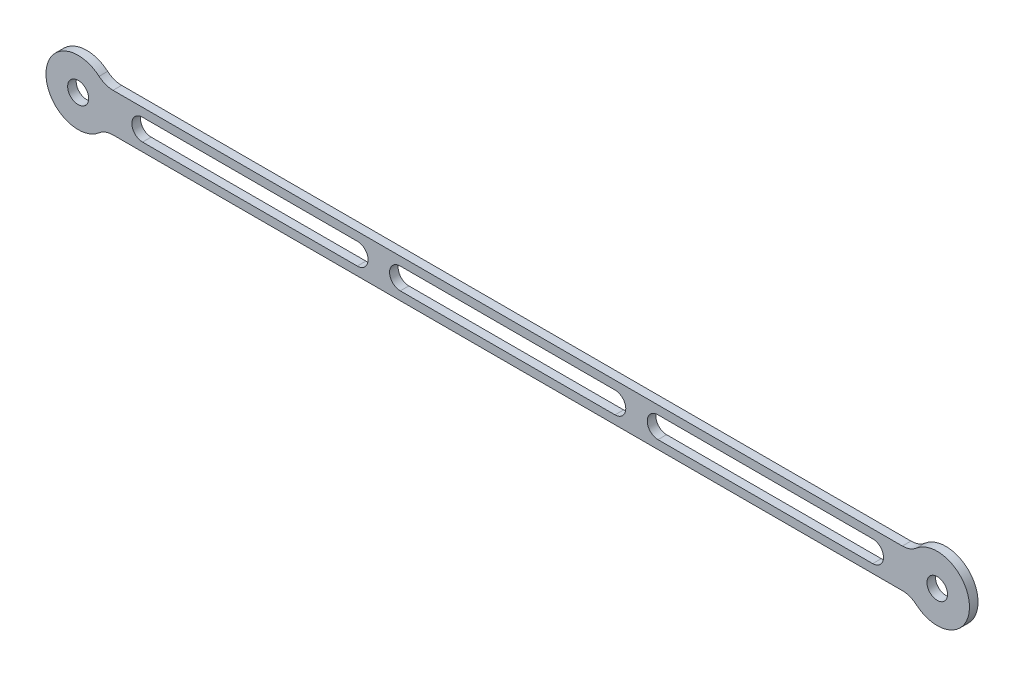
ISO-10303-21;
HEADER;
FILE_DESCRIPTION(('STEP AP214'),'2;1');
FILE_NAME('part.step','',(''),(''),'','','');
FILE_SCHEMA(('AUTOMOTIVE_DESIGN { 1 0 10303 214 1 1 1 1 }'));
ENDSEC;
DATA;
#1=APPLICATION_CONTEXT('core data for automotive mechanical design processes');
#2=APPLICATION_PROTOCOL_DEFINITION('international standard','automotive_design',2000,#1);
#3=PRODUCT_CONTEXT('',#1,'mechanical');
#4=PRODUCT('Part','Part','',(#3));
#5=PRODUCT_RELATED_PRODUCT_CATEGORY('part','',(#4));
#6=PRODUCT_DEFINITION_FORMATION('','',#4);
#7=PRODUCT_DEFINITION_CONTEXT('part definition',#1,'design');
#8=PRODUCT_DEFINITION('design','',#6,#7);
#9=PRODUCT_DEFINITION_SHAPE('','',#8);
#10=(LENGTH_UNIT() NAMED_UNIT(*) SI_UNIT(.MILLI.,.METRE.));
#11=(NAMED_UNIT(*) PLANE_ANGLE_UNIT() SI_UNIT($,.RADIAN.));
#12=(NAMED_UNIT(*) SI_UNIT($,.STERADIAN.) SOLID_ANGLE_UNIT());
#13=UNCERTAINTY_MEASURE_WITH_UNIT(LENGTH_MEASURE(1.E-05),#10,'distance_accuracy_value','');
#14=(GEOMETRIC_REPRESENTATION_CONTEXT(3) GLOBAL_UNCERTAINTY_ASSIGNED_CONTEXT((#13)) GLOBAL_UNIT_ASSIGNED_CONTEXT((#10,
#11,#12)) REPRESENTATION_CONTEXT('',''));
#15=CARTESIAN_POINT('',(0.,0.,0.));
#16=DIRECTION('',(0.,0.,1.));
#17=DIRECTION('',(1.,0.,0.));
#18=AXIS2_PLACEMENT_3D('',#15,#16,#17);
#19=CARTESIAN_POINT('',(0.,-4.5,2.));
#20=DIRECTION('',(0.,1.,0.));
#21=DIRECTION('',(0.,0.,1.));
#22=AXIS2_PLACEMENT_3D('',#19,#20,#21);
#23=PLANE('',#22);
#24=DIRECTION('',(1.,0.,0.));
#25=VECTOR('',#24,1.);
#26=CARTESIAN_POINT('',(0.,-4.5,0.));
#27=LINE('',#26,#25);
#28=CARTESIAN_POINT('',(8.12403840463596,-4.5,0.));
#29=VERTEX_POINT('',#28);
#30=CARTESIAN_POINT('',(191.895961595364,-4.5,0.));
#31=VERTEX_POINT('',#30);
#32=EDGE_CURVE('E274',#29,#31,#27,.T.);
#33=ORIENTED_EDGE('',*,*,#32,.T.);
#34=DIRECTION('',(0.,0.,1.));
#35=VECTOR('',#34,1.);
#36=CARTESIAN_POINT('',(191.895961595364,-4.5,2.));
#37=LINE('',#36,#35);
#38=CARTESIAN_POINT('',(191.895961595364,-4.5,2.));
#39=VERTEX_POINT('',#38);
#40=EDGE_CURVE('E327',#31,#39,#37,.T.);
#41=ORIENTED_EDGE('',*,*,#40,.T.);
#42=DIRECTION('',(1.,0.,0.));
#43=VECTOR('',#42,1.);
#44=CARTESIAN_POINT('',(0.,-4.5,2.));
#45=LINE('',#44,#43);
#46=CARTESIAN_POINT('',(8.12403840463596,-4.5,2.));
#47=VERTEX_POINT('',#46);
#48=EDGE_CURVE('E281',#47,#39,#45,.T.);
#49=ORIENTED_EDGE('',*,*,#48,.F.);
#50=DIRECTION('',(0.,0.,1.));
#51=VECTOR('',#50,1.);
#52=CARTESIAN_POINT('',(8.12403840463596,-4.5,0.));
#53=LINE('',#52,#51);
#54=EDGE_CURVE('E324',#47,#29,#53,.F.);
#55=ORIENTED_EDGE('',*,*,#54,.T.);
#56=EDGE_LOOP('',(#33,#41,#49,#55));
#57=FACE_BOUND('',#56,.T.);
#58=ADVANCED_FACE('F36',(#57),#23,.F.);
#59=CARTESIAN_POINT('',(200.02,0.,2.));
#60=DIRECTION('',(0.,0.,-1.));
#61=DIRECTION('',(-1.,0.,0.));
#62=AXIS2_PLACEMENT_3D('',#59,#60,#61);
#63=CYLINDRICAL_SURFACE('',#62,7.50000000000001);
#64=CARTESIAN_POINT('',(200.02,0.,0.));
#65=DIRECTION('',(0.,0.,1.));
#66=DIRECTION('',(1.,0.,0.));
#67=AXIS2_PLACEMENT_3D('',#64,#65,#66);
#68=CIRCLE('',#67,7.50000000000001);
#69=CARTESIAN_POINT('',(195.145576957218,-5.7,0.));
#70=VERTEX_POINT('',#69);
#71=CARTESIAN_POINT('',(195.145576957218,5.7,0.));
#72=VERTEX_POINT('',#71);
#73=EDGE_CURVE('E302',#70,#72,#68,.T.);
#74=ORIENTED_EDGE('',*,*,#73,.T.);
#75=DIRECTION('',(0.,0.,-1.));
#76=VECTOR('',#75,1.);
#77=CARTESIAN_POINT('',(195.145576957218,5.7,2.));
#78=LINE('',#77,#76);
#79=CARTESIAN_POINT('',(195.145576957218,5.7,2.));
#80=VERTEX_POINT('',#79);
#81=EDGE_CURVE('E322',#72,#80,#78,.F.);
#82=ORIENTED_EDGE('',*,*,#81,.T.);
#83=CARTESIAN_POINT('',(200.02,0.,2.));
#84=DIRECTION('',(0.,0.,1.));
#85=DIRECTION('',(1.,0.,0.));
#86=AXIS2_PLACEMENT_3D('',#83,#84,#85);
#87=CIRCLE('',#86,7.50000000000001);
#88=CARTESIAN_POINT('',(195.145576957218,-5.7,2.));
#89=VERTEX_POINT('',#88);
#90=EDGE_CURVE('E284',#89,#80,#87,.T.);
#91=ORIENTED_EDGE('',*,*,#90,.F.);
#92=DIRECTION('',(0.,0.,-1.));
#93=VECTOR('',#92,1.);
#94=CARTESIAN_POINT('',(195.145576957218,-5.7,2.));
#95=LINE('',#94,#93);
#96=EDGE_CURVE('E319',#89,#70,#95,.T.);
#97=ORIENTED_EDGE('',*,*,#96,.T.);
#98=EDGE_LOOP('',(#74,#82,#91,#97));
#99=FACE_BOUND('',#98,.T.);
#100=ADVANCED_FACE('F372',(#99),#63,.T.);
#101=CARTESIAN_POINT('',(0.,4.5,2.));
#102=DIRECTION('',(0.,1.,0.));
#103=DIRECTION('',(0.,0.,1.));
#104=AXIS2_PLACEMENT_3D('',#101,#102,#103);
#105=PLANE('',#104);
#106=DIRECTION('',(1.,0.,0.));
#107=VECTOR('',#106,1.);
#108=CARTESIAN_POINT('',(0.,4.5,2.));
#109=LINE('',#108,#107);
#110=CARTESIAN_POINT('',(8.12403840463596,4.5,2.));
#111=VERTEX_POINT('',#110);
#112=CARTESIAN_POINT('',(191.895961595364,4.5,2.));
#113=VERTEX_POINT('',#112);
#114=EDGE_CURVE('E288',#111,#113,#109,.T.);
#115=ORIENTED_EDGE('',*,*,#114,.T.);
#116=DIRECTION('',(0.,0.,-1.));
#117=VECTOR('',#116,1.);
#118=CARTESIAN_POINT('',(191.895961595364,4.5,2.));
#119=LINE('',#118,#117);
#120=CARTESIAN_POINT('',(191.895961595364,4.5,0.));
#121=VERTEX_POINT('',#120);
#122=EDGE_CURVE('E316',#113,#121,#119,.T.);
#123=ORIENTED_EDGE('',*,*,#122,.T.);
#124=DIRECTION('',(1.,0.,0.));
#125=VECTOR('',#124,1.);
#126=CARTESIAN_POINT('',(0.,4.5,0.));
#127=LINE('',#126,#125);
#128=CARTESIAN_POINT('',(8.12403840463596,4.5,0.));
#129=VERTEX_POINT('',#128);
#130=EDGE_CURVE('E305',#129,#121,#127,.T.);
#131=ORIENTED_EDGE('',*,*,#130,.F.);
#132=DIRECTION('',(0.,0.,-1.));
#133=VECTOR('',#132,1.);
#134=CARTESIAN_POINT('',(8.12403840463596,4.5,2.));
#135=LINE('',#134,#133);
#136=EDGE_CURVE('E299',#129,#111,#135,.F.);
#137=ORIENTED_EDGE('',*,*,#136,.T.);
#138=EDGE_LOOP('',(#115,#123,#131,#137));
#139=FACE_BOUND('',#138,.T.);
#140=ADVANCED_FACE('F353',(#139),#105,.T.);
#141=CARTESIAN_POINT('',(0.,0.,2.));
#142=DIRECTION('',(0.,0.,-1.));
#143=DIRECTION('',(-1.,0.,0.));
#144=AXIS2_PLACEMENT_3D('',#141,#142,#143);
#145=CYLINDRICAL_SURFACE('',#144,2.45);
#146=CARTESIAN_POINT('',(0.,0.,2.));
#147=DIRECTION('',(0.,0.,1.));
#148=DIRECTION('',(1.,0.,0.));
#149=AXIS2_PLACEMENT_3D('',#146,#147,#148);
#150=CIRCLE('',#149,2.45);
#151=CARTESIAN_POINT('',(2.45,0.,2.));
#152=VERTEX_POINT('',#151);
#153=EDGE_CURVE('E293',#152,#152,#150,.T.);
#154=ORIENTED_EDGE('',*,*,#153,.T.);
#155=EDGE_LOOP('',(#154));
#156=FACE_BOUND('',#155,.T.);
#157=CARTESIAN_POINT('',(0.,0.,0.));
#158=DIRECTION('',(0.,0.,1.));
#159=DIRECTION('',(1.,0.,0.));
#160=AXIS2_PLACEMENT_3D('',#157,#158,#159);
#161=CIRCLE('',#160,2.45);
#162=CARTESIAN_POINT('',(2.45,0.,0.));
#163=VERTEX_POINT('',#162);
#164=EDGE_CURVE('E310',#163,#163,#161,.T.);
#165=ORIENTED_EDGE('',*,*,#164,.F.);
#166=EDGE_LOOP('',(#165));
#167=FACE_BOUND('',#166,.T.);
#168=ADVANCED_FACE('F395',(#156,#167),#145,.F.);
#169=CARTESIAN_POINT('',(0.,0.,2.));
#170=DIRECTION('',(0.,0.,-1.));
#171=DIRECTION('',(-1.,0.,0.));
#172=AXIS2_PLACEMENT_3D('',#169,#170,#171);
#173=CYLINDRICAL_SURFACE('',#172,7.5);
#174=CARTESIAN_POINT('',(0.,0.,0.));
#175=DIRECTION('',(0.,0.,1.));
#176=DIRECTION('',(1.,0.,0.));
#177=AXIS2_PLACEMENT_3D('',#174,#175,#176);
#178=CIRCLE('',#177,7.5);
#179=CARTESIAN_POINT('',(4.87442304278158,5.7,0.));
#180=VERTEX_POINT('',#179);
#181=CARTESIAN_POINT('',(4.87442304278158,-5.7,0.));
#182=VERTEX_POINT('',#181);
#183=EDGE_CURVE('E308',#180,#182,#178,.T.);
#184=ORIENTED_EDGE('',*,*,#183,.T.);
#185=DIRECTION('',(0.,0.,-1.));
#186=VECTOR('',#185,1.);
#187=CARTESIAN_POINT('',(4.87442304278158,-5.7,2.));
#188=LINE('',#187,#186);
#189=CARTESIAN_POINT('',(4.87442304278158,-5.7,2.));
#190=VERTEX_POINT('',#189);
#191=EDGE_CURVE('E51',#182,#190,#188,.F.);
#192=ORIENTED_EDGE('',*,*,#191,.T.);
#193=CARTESIAN_POINT('',(0.,0.,2.));
#194=DIRECTION('',(0.,0.,1.));
#195=DIRECTION('',(1.,0.,0.));
#196=AXIS2_PLACEMENT_3D('',#193,#194,#195);
#197=CIRCLE('',#196,7.5);
#198=CARTESIAN_POINT('',(4.87442304278158,5.7,2.));
#199=VERTEX_POINT('',#198);
#200=EDGE_CURVE('E291',#199,#190,#197,.T.);
#201=ORIENTED_EDGE('',*,*,#200,.F.);
#202=DIRECTION('',(0.,0.,-1.));
#203=VECTOR('',#202,1.);
#204=CARTESIAN_POINT('',(4.87442304278158,5.7,2.));
#205=LINE('',#204,#203);
#206=EDGE_CURVE('E329',#199,#180,#205,.T.);
#207=ORIENTED_EDGE('',*,*,#206,.T.);
#208=EDGE_LOOP('',(#184,#192,#201,#207));
#209=FACE_BOUND('',#208,.T.);
#210=ADVANCED_FACE('F355',(#209),#173,.T.);
#211=CARTESIAN_POINT('',(200.02,0.,2.));
#212=DIRECTION('',(0.,0.,-1.));
#213=DIRECTION('',(-1.,0.,0.));
#214=AXIS2_PLACEMENT_3D('',#211,#212,#213);
#215=CYLINDRICAL_SURFACE('',#214,2.4);
#216=CARTESIAN_POINT('',(200.02,0.,2.));
#217=DIRECTION('',(0.,0.,1.));
#218=DIRECTION('',(1.,0.,0.));
#219=AXIS2_PLACEMENT_3D('',#216,#217,#218);
#220=CIRCLE('',#219,2.4);
#221=CARTESIAN_POINT('',(202.42,0.,2.));
#222=VERTEX_POINT('',#221);
#223=EDGE_CURVE('E296',#222,#222,#220,.T.);
#224=ORIENTED_EDGE('',*,*,#223,.T.);
#225=EDGE_LOOP('',(#224));
#226=FACE_BOUND('',#225,.T.);
#227=CARTESIAN_POINT('',(200.02,0.,0.));
#228=DIRECTION('',(0.,0.,1.));
#229=DIRECTION('',(1.,0.,0.));
#230=AXIS2_PLACEMENT_3D('',#227,#228,#229);
#231=CIRCLE('',#230,2.4);
#232=CARTESIAN_POINT('',(202.42,0.,0.));
#233=VERTEX_POINT('',#232);
#234=EDGE_CURVE('E285',#233,#233,#231,.T.);
#235=ORIENTED_EDGE('',*,*,#234,.F.);
#236=EDGE_LOOP('',(#235));
#237=FACE_BOUND('',#236,.T.);
#238=ADVANCED_FACE('F398',(#226,#237),#215,.F.);
#239=CARTESIAN_POINT('',(0.,0.,2.));
#240=DIRECTION('',(0.,0.,1.));
#241=DIRECTION('',(1.,0.,0.));
#242=AXIS2_PLACEMENT_3D('',#239,#240,#241);
#243=PLANE('',#242);
#244=CARTESIAN_POINT('',(15.,-4.18977760661176E-13,2.));
#245=DIRECTION('',(0.,0.,1.));
#246=DIRECTION('',(1.,0.,0.));
#247=AXIS2_PLACEMENT_3D('',#244,#245,#246);
#248=CIRCLE('',#247,2.49999999999958);
#249=CARTESIAN_POINT('',(15.,2.49999999999958,2.));
#250=VERTEX_POINT('',#249);
#251=CARTESIAN_POINT('',(15.,-2.49999999999958,2.));
#252=VERTEX_POINT('',#251);
#253=EDGE_CURVE('E180',#250,#252,#248,.T.);
#254=ORIENTED_EDGE('',*,*,#253,.F.);
#255=DIRECTION('',(-1.,0.,0.));
#256=VECTOR('',#255,1.);
#257=CARTESIAN_POINT('',(15.,2.49999999999958,2.));
#258=LINE('',#257,#256);
#259=CARTESIAN_POINT('',(65.,2.49999999999958,2.));
#260=VERTEX_POINT('',#259);
#261=EDGE_CURVE('E198',#260,#250,#258,.T.);
#262=ORIENTED_EDGE('',*,*,#261,.F.);
#263=CARTESIAN_POINT('',(65.,-4.09792909667571E-13,2.));
#264=DIRECTION('',(0.,0.,1.));
#265=DIRECTION('',(1.,0.,0.));
#266=AXIS2_PLACEMENT_3D('',#263,#264,#265);
#267=CIRCLE('',#266,2.49999999999958);
#268=CARTESIAN_POINT('',(65.,-2.49999999999999,2.));
#269=VERTEX_POINT('',#268);
#270=EDGE_CURVE('E201',#269,#260,#267,.T.);
#271=ORIENTED_EDGE('',*,*,#270,.F.);
#272=DIRECTION('',(1.,0.,0.));
#273=VECTOR('',#272,1.);
#274=CARTESIAN_POINT('',(15.,-2.49999999999958,2.));
#275=LINE('',#274,#273);
#276=EDGE_CURVE('E207',#252,#269,#275,.T.);
#277=ORIENTED_EDGE('',*,*,#276,.F.);
#278=EDGE_LOOP('',(#254,#262,#271,#277));
#279=FACE_BOUND('',#278,.T.);
#280=CARTESIAN_POINT('',(135.,0.,2.));
#281=DIRECTION('',(0.,0.,1.));
#282=DIRECTION('',(1.,0.,0.));
#283=AXIS2_PLACEMENT_3D('',#280,#281,#282);
#284=CIRCLE('',#283,2.5);
#285=CARTESIAN_POINT('',(135.,2.5,2.));
#286=VERTEX_POINT('',#285);
#287=CARTESIAN_POINT('',(135.,-2.5,2.));
#288=VERTEX_POINT('',#287);
#289=EDGE_CURVE('E213',#286,#288,#284,.T.);
#290=ORIENTED_EDGE('',*,*,#289,.F.);
#291=DIRECTION('',(-1.,0.,0.));
#292=VECTOR('',#291,1.);
#293=CARTESIAN_POINT('',(135.,2.5,2.));
#294=LINE('',#293,#292);
#295=CARTESIAN_POINT('',(185.,2.5,2.));
#296=VERTEX_POINT('',#295);
#297=EDGE_CURVE('E221',#296,#286,#294,.T.);
#298=ORIENTED_EDGE('',*,*,#297,.F.);
#299=CARTESIAN_POINT('',(185.,0.,2.));
#300=DIRECTION('',(0.,0.,1.));
#301=DIRECTION('',(1.,0.,0.));
#302=AXIS2_PLACEMENT_3D('',#299,#300,#301);
#303=CIRCLE('',#302,2.5);
#304=CARTESIAN_POINT('',(185.,-2.49999999999999,2.));
#305=VERTEX_POINT('',#304);
#306=EDGE_CURVE('E235',#305,#296,#303,.T.);
#307=ORIENTED_EDGE('',*,*,#306,.F.);
#308=DIRECTION('',(1.,0.,0.));
#309=VECTOR('',#308,1.);
#310=CARTESIAN_POINT('',(135.,-2.5,2.));
#311=LINE('',#310,#309);
#312=EDGE_CURVE('E232',#288,#305,#311,.T.);
#313=ORIENTED_EDGE('',*,*,#312,.F.);
#314=EDGE_LOOP('',(#290,#298,#307,#313));
#315=FACE_BOUND('',#314,.T.);
#316=CARTESIAN_POINT('',(75.,0.,2.));
#317=DIRECTION('',(0.,0.,1.));
#318=DIRECTION('',(1.,0.,0.));
#319=AXIS2_PLACEMENT_3D('',#316,#317,#318);
#320=CIRCLE('',#319,2.50000000000001);
#321=CARTESIAN_POINT('',(75.,2.50000000000001,2.));
#322=VERTEX_POINT('',#321);
#323=CARTESIAN_POINT('',(75.,-2.50000000000001,2.));
#324=VERTEX_POINT('',#323);
#325=EDGE_CURVE('E242',#322,#324,#320,.T.);
#326=ORIENTED_EDGE('',*,*,#325,.F.);
#327=DIRECTION('',(-1.,0.,0.));
#328=VECTOR('',#327,1.);
#329=CARTESIAN_POINT('',(75.,2.50000000000001,2.));
#330=LINE('',#329,#328);
#331=CARTESIAN_POINT('',(125.,2.50000000000002,2.));
#332=VERTEX_POINT('',#331);
#333=EDGE_CURVE('E253',#332,#322,#330,.T.);
#334=ORIENTED_EDGE('',*,*,#333,.F.);
#335=CARTESIAN_POINT('',(125.,0.,2.));
#336=DIRECTION('',(0.,0.,1.));
#337=DIRECTION('',(1.,0.,0.));
#338=AXIS2_PLACEMENT_3D('',#335,#336,#337);
#339=CIRCLE('',#338,2.50000000000001);
#340=CARTESIAN_POINT('',(125.,-2.5,2.));
#341=VERTEX_POINT('',#340);
#342=EDGE_CURVE('E267',#341,#332,#339,.T.);
#343=ORIENTED_EDGE('',*,*,#342,.F.);
#344=DIRECTION('',(1.,0.,0.));
#345=VECTOR('',#344,1.);
#346=CARTESIAN_POINT('',(75.,-2.50000000000001,2.));
#347=LINE('',#346,#345);
#348=EDGE_CURVE('E264',#324,#341,#347,.T.);
#349=ORIENTED_EDGE('',*,*,#348,.F.);
#350=EDGE_LOOP('',(#326,#334,#343,#349));
#351=FACE_BOUND('',#350,.T.);
#352=ORIENTED_EDGE('',*,*,#200,.T.);
#353=CARTESIAN_POINT('',(8.12403840463596,-9.5,2.));
#354=DIRECTION('',(0.,0.,1.));
#355=DIRECTION('',(1.,0.,0.));
#356=AXIS2_PLACEMENT_3D('',#353,#354,#355);
#357=CIRCLE('',#356,5.);
#358=EDGE_CURVE('E343',#190,#47,#357,.F.);
#359=ORIENTED_EDGE('',*,*,#358,.T.);
#360=ORIENTED_EDGE('',*,*,#48,.T.);
#361=CARTESIAN_POINT('',(191.895961595364,-9.5,2.));
#362=DIRECTION('',(0.,0.,1.));
#363=DIRECTION('',(1.,0.,0.));
#364=AXIS2_PLACEMENT_3D('',#361,#362,#363);
#365=CIRCLE('',#364,5.);
#366=EDGE_CURVE('E339',#39,#89,#365,.F.);
#367=ORIENTED_EDGE('',*,*,#366,.T.);
#368=ORIENTED_EDGE('',*,*,#90,.T.);
#369=CARTESIAN_POINT('',(191.895961595364,9.5,2.));
#370=DIRECTION('',(0.,0.,1.));
#371=DIRECTION('',(1.,0.,0.));
#372=AXIS2_PLACEMENT_3D('',#369,#370,#371);
#373=CIRCLE('',#372,5.);
#374=EDGE_CURVE('E335',#80,#113,#373,.F.);
#375=ORIENTED_EDGE('',*,*,#374,.T.);
#376=ORIENTED_EDGE('',*,*,#114,.F.);
#377=CARTESIAN_POINT('',(8.12403840463596,9.5,2.));
#378=DIRECTION('',(0.,0.,1.));
#379=DIRECTION('',(1.,0.,0.));
#380=AXIS2_PLACEMENT_3D('',#377,#378,#379);
#381=CIRCLE('',#380,5.);
#382=EDGE_CURVE('E11',#111,#199,#381,.F.);
#383=ORIENTED_EDGE('',*,*,#382,.T.);
#384=EDGE_LOOP('',(#352,#359,#360,#367,#368,#375,#376,#383));
#385=FACE_BOUND('',#384,.T.);
#386=ORIENTED_EDGE('',*,*,#153,.F.);
#387=EDGE_LOOP('',(#386));
#388=FACE_BOUND('',#387,.T.);
#389=ORIENTED_EDGE('',*,*,#223,.F.);
#390=EDGE_LOOP('',(#389));
#391=FACE_BOUND('',#390,.T.);
#392=ADVANCED_FACE('F357',(#279,#315,#351,#385,#388,#391),#243,.T.);
#393=CARTESIAN_POINT('',(0.,0.,0.));
#394=DIRECTION('',(0.,0.,1.));
#395=DIRECTION('',(1.,0.,0.));
#396=AXIS2_PLACEMENT_3D('',#393,#394,#395);
#397=PLANE('',#396);
#398=DIRECTION('',(-1.,0.,0.));
#399=VECTOR('',#398,1.);
#400=CARTESIAN_POINT('',(15.,2.49999999999958,0.));
#401=LINE('',#400,#399);
#402=CARTESIAN_POINT('',(65.,2.49999999999958,0.));
#403=VERTEX_POINT('',#402);
#404=CARTESIAN_POINT('',(15.,2.49999999999958,0.));
#405=VERTEX_POINT('',#404);
#406=EDGE_CURVE('E185',#403,#405,#401,.T.);
#407=ORIENTED_EDGE('',*,*,#406,.T.);
#408=CARTESIAN_POINT('',(15.,-4.18977760661176E-13,0.));
#409=DIRECTION('',(0.,0.,1.));
#410=DIRECTION('',(1.,0.,0.));
#411=AXIS2_PLACEMENT_3D('',#408,#409,#410);
#412=CIRCLE('',#411,2.49999999999958);
#413=CARTESIAN_POINT('',(15.,-2.49999999999958,0.));
#414=VERTEX_POINT('',#413);
#415=EDGE_CURVE('E177',#405,#414,#412,.T.);
#416=ORIENTED_EDGE('',*,*,#415,.T.);
#417=DIRECTION('',(1.,0.,0.));
#418=VECTOR('',#417,1.);
#419=CARTESIAN_POINT('',(15.,-2.49999999999958,0.));
#420=LINE('',#419,#418);
#421=CARTESIAN_POINT('',(65.,-2.49999999999958,0.));
#422=VERTEX_POINT('',#421);
#423=EDGE_CURVE('E189',#414,#422,#420,.T.);
#424=ORIENTED_EDGE('',*,*,#423,.T.);
#425=CARTESIAN_POINT('',(65.,-4.09792909667571E-13,0.));
#426=DIRECTION('',(0.,0.,1.));
#427=DIRECTION('',(1.,0.,0.));
#428=AXIS2_PLACEMENT_3D('',#425,#426,#427);
#429=CIRCLE('',#428,2.49999999999958);
#430=EDGE_CURVE('E193',#422,#403,#429,.T.);
#431=ORIENTED_EDGE('',*,*,#430,.T.);
#432=EDGE_LOOP('',(#407,#416,#424,#431));
#433=FACE_BOUND('',#432,.T.);
#434=DIRECTION('',(-1.,0.,0.));
#435=VECTOR('',#434,1.);
#436=CARTESIAN_POINT('',(135.,2.5,0.));
#437=LINE('',#436,#435);
#438=CARTESIAN_POINT('',(185.,2.5,0.));
#439=VERTEX_POINT('',#438);
#440=CARTESIAN_POINT('',(135.,2.5,0.));
#441=VERTEX_POINT('',#440);
#442=EDGE_CURVE('E227',#439,#441,#437,.T.);
#443=ORIENTED_EDGE('',*,*,#442,.T.);
#444=CARTESIAN_POINT('',(135.,0.,0.));
#445=DIRECTION('',(0.,0.,1.));
#446=DIRECTION('',(1.,0.,0.));
#447=AXIS2_PLACEMENT_3D('',#444,#445,#446);
#448=CIRCLE('',#447,2.5);
#449=CARTESIAN_POINT('',(135.,-2.5,0.));
#450=VERTEX_POINT('',#449);
#451=EDGE_CURVE('E217',#441,#450,#448,.T.);
#452=ORIENTED_EDGE('',*,*,#451,.T.);
#453=DIRECTION('',(1.,0.,0.));
#454=VECTOR('',#453,1.);
#455=CARTESIAN_POINT('',(135.,-2.5,0.));
#456=LINE('',#455,#454);
#457=CARTESIAN_POINT('',(185.,-2.5,0.));
#458=VERTEX_POINT('',#457);
#459=EDGE_CURVE('E220',#450,#458,#456,.T.);
#460=ORIENTED_EDGE('',*,*,#459,.T.);
#461=CARTESIAN_POINT('',(185.,0.,0.));
#462=DIRECTION('',(0.,0.,1.));
#463=DIRECTION('',(1.,0.,0.));
#464=AXIS2_PLACEMENT_3D('',#461,#462,#463);
#465=CIRCLE('',#464,2.5);
#466=EDGE_CURVE('E224',#458,#439,#465,.T.);
#467=ORIENTED_EDGE('',*,*,#466,.T.);
#468=EDGE_LOOP('',(#443,#452,#460,#467));
#469=FACE_BOUND('',#468,.T.);
#470=DIRECTION('',(-1.,0.,0.));
#471=VECTOR('',#470,1.);
#472=CARTESIAN_POINT('',(75.,2.50000000000001,0.));
#473=LINE('',#472,#471);
#474=CARTESIAN_POINT('',(125.,2.50000000000002,0.));
#475=VERTEX_POINT('',#474);
#476=CARTESIAN_POINT('',(75.,2.50000000000001,0.));
#477=VERTEX_POINT('',#476);
#478=EDGE_CURVE('E259',#475,#477,#473,.T.);
#479=ORIENTED_EDGE('',*,*,#478,.T.);
#480=CARTESIAN_POINT('',(75.,0.,0.));
#481=DIRECTION('',(0.,0.,1.));
#482=DIRECTION('',(1.,0.,0.));
#483=AXIS2_PLACEMENT_3D('',#480,#481,#482);
#484=CIRCLE('',#483,2.50000000000001);
#485=CARTESIAN_POINT('',(75.,-2.50000000000001,0.));
#486=VERTEX_POINT('',#485);
#487=EDGE_CURVE('E249',#477,#486,#484,.T.);
#488=ORIENTED_EDGE('',*,*,#487,.T.);
#489=DIRECTION('',(1.,0.,0.));
#490=VECTOR('',#489,1.);
#491=CARTESIAN_POINT('',(75.,-2.50000000000001,0.));
#492=LINE('',#491,#490);
#493=CARTESIAN_POINT('',(125.,-2.5,0.));
#494=VERTEX_POINT('',#493);
#495=EDGE_CURVE('E252',#486,#494,#492,.T.);
#496=ORIENTED_EDGE('',*,*,#495,.T.);
#497=CARTESIAN_POINT('',(125.,0.,0.));
#498=DIRECTION('',(0.,0.,1.));
#499=DIRECTION('',(1.,0.,0.));
#500=AXIS2_PLACEMENT_3D('',#497,#498,#499);
#501=CIRCLE('',#500,2.50000000000001);
#502=EDGE_CURVE('E256',#494,#475,#501,.T.);
#503=ORIENTED_EDGE('',*,*,#502,.T.);
#504=EDGE_LOOP('',(#479,#488,#496,#503));
#505=FACE_BOUND('',#504,.T.);
#506=ORIENTED_EDGE('',*,*,#32,.F.);
#507=CARTESIAN_POINT('',(8.12403840463596,-9.5,0.));
#508=DIRECTION('',(0.,0.,1.));
#509=DIRECTION('',(1.,0.,0.));
#510=AXIS2_PLACEMENT_3D('',#507,#508,#509);
#511=CIRCLE('',#510,5.);
#512=EDGE_CURVE('E341',#29,#182,#511,.T.);
#513=ORIENTED_EDGE('',*,*,#512,.T.);
#514=ORIENTED_EDGE('',*,*,#183,.F.);
#515=CARTESIAN_POINT('',(8.12403840463596,9.5,0.));
#516=DIRECTION('',(0.,0.,1.));
#517=DIRECTION('',(1.,0.,0.));
#518=AXIS2_PLACEMENT_3D('',#515,#516,#517);
#519=CIRCLE('',#518,5.);
#520=EDGE_CURVE('E44',#180,#129,#519,.T.);
#521=ORIENTED_EDGE('',*,*,#520,.T.);
#522=ORIENTED_EDGE('',*,*,#130,.T.);
#523=CARTESIAN_POINT('',(191.895961595364,9.5,0.));
#524=DIRECTION('',(0.,0.,1.));
#525=DIRECTION('',(1.,0.,0.));
#526=AXIS2_PLACEMENT_3D('',#523,#524,#525);
#527=CIRCLE('',#526,5.);
#528=EDGE_CURVE('E333',#121,#72,#527,.T.);
#529=ORIENTED_EDGE('',*,*,#528,.T.);
#530=ORIENTED_EDGE('',*,*,#73,.F.);
#531=CARTESIAN_POINT('',(191.895961595364,-9.5,0.));
#532=DIRECTION('',(0.,0.,1.));
#533=DIRECTION('',(1.,0.,0.));
#534=AXIS2_PLACEMENT_3D('',#531,#532,#533);
#535=CIRCLE('',#534,5.);
#536=EDGE_CURVE('E337',#70,#31,#535,.T.);
#537=ORIENTED_EDGE('',*,*,#536,.T.);
#538=EDGE_LOOP('',(#506,#513,#514,#521,#522,#529,#530,#537));
#539=FACE_BOUND('',#538,.T.);
#540=ORIENTED_EDGE('',*,*,#164,.T.);
#541=EDGE_LOOP('',(#540));
#542=FACE_BOUND('',#541,.T.);
#543=ORIENTED_EDGE('',*,*,#234,.T.);
#544=EDGE_LOOP('',(#543));
#545=FACE_BOUND('',#544,.T.);
#546=ADVANCED_FACE('F195',(#433,#469,#505,#539,#542,#545),#397,.F.);
#547=CARTESIAN_POINT('',(75.,0.,0.));
#548=DIRECTION('',(0.,0.,1.));
#549=DIRECTION('',(1.,0.,0.));
#550=AXIS2_PLACEMENT_3D('',#547,#548,#549);
#551=CYLINDRICAL_SURFACE('',#550,2.50000000000001);
#552=ORIENTED_EDGE('',*,*,#325,.T.);
#553=DIRECTION('',(0.,0.,1.));
#554=VECTOR('',#553,1.);
#555=CARTESIAN_POINT('',(75.,-2.50000000000001,0.));
#556=LINE('',#555,#554);
#557=EDGE_CURVE('E262',#486,#324,#556,.T.);
#558=ORIENTED_EDGE('',*,*,#557,.F.);
#559=ORIENTED_EDGE('',*,*,#487,.F.);
#560=DIRECTION('',(0.,0.,1.));
#561=VECTOR('',#560,1.);
#562=CARTESIAN_POINT('',(75.,2.50000000000001,0.));
#563=LINE('',#562,#561);
#564=EDGE_CURVE('E272',#477,#322,#563,.T.);
#565=ORIENTED_EDGE('',*,*,#564,.T.);
#566=EDGE_LOOP('',(#552,#558,#559,#565));
#567=FACE_BOUND('',#566,.T.);
#568=ADVANCED_FACE('F407',(#567),#551,.F.);
#569=CARTESIAN_POINT('',(75.,2.50000000000001,0.));
#570=DIRECTION('',(0.,1.,0.));
#571=DIRECTION('',(-1.,0.,0.));
#572=AXIS2_PLACEMENT_3D('',#569,#570,#571);
#573=PLANE('',#572);
#574=ORIENTED_EDGE('',*,*,#333,.T.);
#575=ORIENTED_EDGE('',*,*,#564,.F.);
#576=ORIENTED_EDGE('',*,*,#478,.F.);
#577=DIRECTION('',(0.,0.,1.));
#578=VECTOR('',#577,1.);
#579=CARTESIAN_POINT('',(125.,2.50000000000002,0.));
#580=LINE('',#579,#578);
#581=EDGE_CURVE('E275',#475,#332,#580,.T.);
#582=ORIENTED_EDGE('',*,*,#581,.T.);
#583=EDGE_LOOP('',(#574,#575,#576,#582));
#584=FACE_BOUND('',#583,.T.);
#585=ADVANCED_FACE('F413',(#584),#573,.F.);
#586=CARTESIAN_POINT('',(125.,0.,0.));
#587=DIRECTION('',(0.,0.,1.));
#588=DIRECTION('',(1.,0.,0.));
#589=AXIS2_PLACEMENT_3D('',#586,#587,#588);
#590=CYLINDRICAL_SURFACE('',#589,2.50000000000001);
#591=ORIENTED_EDGE('',*,*,#342,.T.);
#592=ORIENTED_EDGE('',*,*,#581,.F.);
#593=ORIENTED_EDGE('',*,*,#502,.F.);
#594=DIRECTION('',(0.,0.,1.));
#595=VECTOR('',#594,1.);
#596=CARTESIAN_POINT('',(125.,-2.5,0.));
#597=LINE('',#596,#595);
#598=EDGE_CURVE('E277',#494,#341,#597,.T.);
#599=ORIENTED_EDGE('',*,*,#598,.T.);
#600=EDGE_LOOP('',(#591,#592,#593,#599));
#601=FACE_BOUND('',#600,.T.);
#602=ADVANCED_FACE('F419',(#601),#590,.F.);
#603=CARTESIAN_POINT('',(75.,-2.50000000000001,0.));
#604=DIRECTION('',(0.,-1.,0.));
#605=DIRECTION('',(1.,0.,0.));
#606=AXIS2_PLACEMENT_3D('',#603,#604,#605);
#607=PLANE('',#606);
#608=ORIENTED_EDGE('',*,*,#348,.T.);
#609=ORIENTED_EDGE('',*,*,#598,.F.);
#610=ORIENTED_EDGE('',*,*,#495,.F.);
#611=ORIENTED_EDGE('',*,*,#557,.T.);
#612=EDGE_LOOP('',(#608,#609,#610,#611));
#613=FACE_BOUND('',#612,.T.);
#614=ADVANCED_FACE('F415',(#613),#607,.F.);
#615=CARTESIAN_POINT('',(135.,0.,0.));
#616=DIRECTION('',(0.,0.,1.));
#617=DIRECTION('',(1.,0.,0.));
#618=AXIS2_PLACEMENT_3D('',#615,#616,#617);
#619=CYLINDRICAL_SURFACE('',#618,2.5);
#620=ORIENTED_EDGE('',*,*,#289,.T.);
#621=DIRECTION('',(0.,0.,1.));
#622=VECTOR('',#621,1.);
#623=CARTESIAN_POINT('',(135.,-2.5,0.));
#624=LINE('',#623,#622);
#625=EDGE_CURVE('E230',#450,#288,#624,.T.);
#626=ORIENTED_EDGE('',*,*,#625,.F.);
#627=ORIENTED_EDGE('',*,*,#451,.F.);
#628=DIRECTION('',(0.,0.,1.));
#629=VECTOR('',#628,1.);
#630=CARTESIAN_POINT('',(135.,2.5,0.));
#631=LINE('',#630,#629);
#632=EDGE_CURVE('E240',#441,#286,#631,.T.);
#633=ORIENTED_EDGE('',*,*,#632,.T.);
#634=EDGE_LOOP('',(#620,#626,#627,#633));
#635=FACE_BOUND('',#634,.T.);
#636=ADVANCED_FACE('F418',(#635),#619,.F.);
#637=CARTESIAN_POINT('',(135.,2.5,0.));
#638=DIRECTION('',(0.,1.,0.));
#639=DIRECTION('',(0.,0.,1.));
#640=AXIS2_PLACEMENT_3D('',#637,#638,#639);
#641=PLANE('',#640);
#642=ORIENTED_EDGE('',*,*,#297,.T.);
#643=ORIENTED_EDGE('',*,*,#632,.F.);
#644=ORIENTED_EDGE('',*,*,#442,.F.);
#645=DIRECTION('',(0.,0.,1.));
#646=VECTOR('',#645,1.);
#647=CARTESIAN_POINT('',(185.,2.5,0.));
#648=LINE('',#647,#646);
#649=EDGE_CURVE('E243',#439,#296,#648,.T.);
#650=ORIENTED_EDGE('',*,*,#649,.T.);
#651=EDGE_LOOP('',(#642,#643,#644,#650));
#652=FACE_BOUND('',#651,.T.);
#653=ADVANCED_FACE('F429',(#652),#641,.F.);
#654=CARTESIAN_POINT('',(185.,0.,0.));
#655=DIRECTION('',(0.,0.,1.));
#656=DIRECTION('',(1.,0.,0.));
#657=AXIS2_PLACEMENT_3D('',#654,#655,#656);
#658=CYLINDRICAL_SURFACE('',#657,2.5);
#659=ORIENTED_EDGE('',*,*,#306,.T.);
#660=ORIENTED_EDGE('',*,*,#649,.F.);
#661=ORIENTED_EDGE('',*,*,#466,.F.);
#662=DIRECTION('',(0.,0.,1.));
#663=VECTOR('',#662,1.);
#664=CARTESIAN_POINT('',(185.,-2.49999999999999,0.));
#665=LINE('',#664,#663);
#666=EDGE_CURVE('E245',#458,#305,#665,.T.);
#667=ORIENTED_EDGE('',*,*,#666,.T.);
#668=EDGE_LOOP('',(#659,#660,#661,#667));
#669=FACE_BOUND('',#668,.T.);
#670=ADVANCED_FACE('F434',(#669),#658,.F.);
#671=CARTESIAN_POINT('',(135.,-2.5,0.));
#672=DIRECTION('',(0.,-1.,0.));
#673=DIRECTION('',(0.,0.,-1.));
#674=AXIS2_PLACEMENT_3D('',#671,#672,#673);
#675=PLANE('',#674);
#676=ORIENTED_EDGE('',*,*,#312,.T.);
#677=ORIENTED_EDGE('',*,*,#666,.F.);
#678=ORIENTED_EDGE('',*,*,#459,.F.);
#679=ORIENTED_EDGE('',*,*,#625,.T.);
#680=EDGE_LOOP('',(#676,#677,#678,#679));
#681=FACE_BOUND('',#680,.T.);
#682=ADVANCED_FACE('F431',(#681),#675,.F.);
#683=CARTESIAN_POINT('',(15.,-4.18977760661176E-13,0.));
#684=DIRECTION('',(0.,0.,1.));
#685=DIRECTION('',(1.,0.,0.));
#686=AXIS2_PLACEMENT_3D('',#683,#684,#685);
#687=CYLINDRICAL_SURFACE('',#686,2.49999999999958);
#688=ORIENTED_EDGE('',*,*,#253,.T.);
#689=DIRECTION('',(0.,0.,1.));
#690=VECTOR('',#689,1.);
#691=CARTESIAN_POINT('',(15.,-2.49999999999958,0.));
#692=LINE('',#691,#690);
#693=EDGE_CURVE('E173',#414,#252,#692,.T.);
#694=ORIENTED_EDGE('',*,*,#693,.F.);
#695=ORIENTED_EDGE('',*,*,#415,.F.);
#696=DIRECTION('',(0.,0.,1.));
#697=VECTOR('',#696,1.);
#698=CARTESIAN_POINT('',(15.,2.49999999999958,0.));
#699=LINE('',#698,#697);
#700=EDGE_CURVE('E211',#405,#250,#699,.T.);
#701=ORIENTED_EDGE('',*,*,#700,.T.);
#702=EDGE_LOOP('',(#688,#694,#695,#701));
#703=FACE_BOUND('',#702,.T.);
#704=ADVANCED_FACE('F175',(#703),#687,.F.);
#705=CARTESIAN_POINT('',(15.,2.49999999999958,0.));
#706=DIRECTION('',(0.,1.,0.));
#707=DIRECTION('',(0.,0.,1.));
#708=AXIS2_PLACEMENT_3D('',#705,#706,#707);
#709=PLANE('',#708);
#710=ORIENTED_EDGE('',*,*,#261,.T.);
#711=ORIENTED_EDGE('',*,*,#700,.F.);
#712=ORIENTED_EDGE('',*,*,#406,.F.);
#713=DIRECTION('',(0.,0.,1.));
#714=VECTOR('',#713,1.);
#715=CARTESIAN_POINT('',(65.,2.49999999999958,0.));
#716=LINE('',#715,#714);
#717=EDGE_CURVE('E214',#403,#260,#716,.T.);
#718=ORIENTED_EDGE('',*,*,#717,.T.);
#719=EDGE_LOOP('',(#710,#711,#712,#718));
#720=FACE_BOUND('',#719,.T.);
#721=ADVANCED_FACE('F443',(#720),#709,.F.);
#722=CARTESIAN_POINT('',(65.,-4.09792909667571E-13,0.));
#723=DIRECTION('',(0.,0.,1.));
#724=DIRECTION('',(1.,0.,0.));
#725=AXIS2_PLACEMENT_3D('',#722,#723,#724);
#726=CYLINDRICAL_SURFACE('',#725,2.49999999999958);
#727=ORIENTED_EDGE('',*,*,#270,.T.);
#728=ORIENTED_EDGE('',*,*,#717,.F.);
#729=ORIENTED_EDGE('',*,*,#430,.F.);
#730=DIRECTION('',(0.,0.,1.));
#731=VECTOR('',#730,1.);
#732=CARTESIAN_POINT('',(65.,-2.49999999999999,0.));
#733=LINE('',#732,#731);
#734=EDGE_CURVE('E184',#422,#269,#733,.T.);
#735=ORIENTED_EDGE('',*,*,#734,.T.);
#736=EDGE_LOOP('',(#727,#728,#729,#735));
#737=FACE_BOUND('',#736,.T.);
#738=ADVANCED_FACE('F384',(#737),#726,.F.);
#739=CARTESIAN_POINT('',(15.,-2.49999999999958,0.));
#740=DIRECTION('',(0.,-1.,0.));
#741=DIRECTION('',(0.,0.,-1.));
#742=AXIS2_PLACEMENT_3D('',#739,#740,#741);
#743=PLANE('',#742);
#744=ORIENTED_EDGE('',*,*,#276,.T.);
#745=ORIENTED_EDGE('',*,*,#734,.F.);
#746=ORIENTED_EDGE('',*,*,#423,.F.);
#747=ORIENTED_EDGE('',*,*,#693,.T.);
#748=EDGE_LOOP('',(#744,#745,#746,#747));
#749=FACE_BOUND('',#748,.T.);
#750=ADVANCED_FACE('F190',(#749),#743,.F.);
#751=CARTESIAN_POINT('',(191.895961595364,9.5,2.));
#752=DIRECTION('',(0.,0.,-1.));
#753=DIRECTION('',(-1.,0.,0.));
#754=AXIS2_PLACEMENT_3D('',#751,#752,#753);
#755=CYLINDRICAL_SURFACE('',#754,5.);
#756=ORIENTED_EDGE('',*,*,#374,.F.);
#757=ORIENTED_EDGE('',*,*,#81,.F.);
#758=ORIENTED_EDGE('',*,*,#528,.F.);
#759=ORIENTED_EDGE('',*,*,#122,.F.);
#760=EDGE_LOOP('',(#756,#757,#758,#759));
#761=FACE_BOUND('',#760,.T.);
#762=ADVANCED_FACE('F376',(#761),#755,.F.);
#763=CARTESIAN_POINT('',(191.895961595364,-9.5,2.));
#764=DIRECTION('',(0.,0.,-1.));
#765=DIRECTION('',(-1.,0.,0.));
#766=AXIS2_PLACEMENT_3D('',#763,#764,#765);
#767=CYLINDRICAL_SURFACE('',#766,5.);
#768=ORIENTED_EDGE('',*,*,#366,.F.);
#769=ORIENTED_EDGE('',*,*,#40,.F.);
#770=ORIENTED_EDGE('',*,*,#536,.F.);
#771=ORIENTED_EDGE('',*,*,#96,.F.);
#772=EDGE_LOOP('',(#768,#769,#770,#771));
#773=FACE_BOUND('',#772,.T.);
#774=ADVANCED_FACE('F369',(#773),#767,.F.);
#775=CARTESIAN_POINT('',(8.12403840463596,-9.5,2.));
#776=DIRECTION('',(0.,0.,-1.));
#777=DIRECTION('',(-1.,0.,0.));
#778=AXIS2_PLACEMENT_3D('',#775,#776,#777);
#779=CYLINDRICAL_SURFACE('',#778,5.);
#780=ORIENTED_EDGE('',*,*,#358,.F.);
#781=ORIENTED_EDGE('',*,*,#191,.F.);
#782=ORIENTED_EDGE('',*,*,#512,.F.);
#783=ORIENTED_EDGE('',*,*,#54,.F.);
#784=EDGE_LOOP('',(#780,#781,#782,#783));
#785=FACE_BOUND('',#784,.T.);
#786=ADVANCED_FACE('F362',(#785),#779,.F.);
#787=CARTESIAN_POINT('',(8.12403840463596,9.5,2.));
#788=DIRECTION('',(0.,0.,-1.));
#789=DIRECTION('',(-1.,0.,0.));
#790=AXIS2_PLACEMENT_3D('',#787,#788,#789);
#791=CYLINDRICAL_SURFACE('',#790,5.);
#792=ORIENTED_EDGE('',*,*,#382,.F.);
#793=ORIENTED_EDGE('',*,*,#136,.F.);
#794=ORIENTED_EDGE('',*,*,#520,.F.);
#795=ORIENTED_EDGE('',*,*,#206,.F.);
#796=EDGE_LOOP('',(#792,#793,#794,#795));
#797=FACE_BOUND('',#796,.T.);
#798=ADVANCED_FACE('F38',(#797),#791,.F.);
#799=CLOSED_SHELL('',(#58,#100,#140,#168,#210,#238,#392,#546,#568,#585,#602,#614,#636,#653,#670,
#682,#704,#721,#738,#750,#762,#774,#786,#798));
#800=MANIFOLD_SOLID_BREP('B2',#799);
#801=ADVANCED_BREP_SHAPE_REPRESENTATION('',(#18,#800),#14);
#802=SHAPE_DEFINITION_REPRESENTATION(#9,#801);
ENDSEC;
END-ISO-10303-21;
